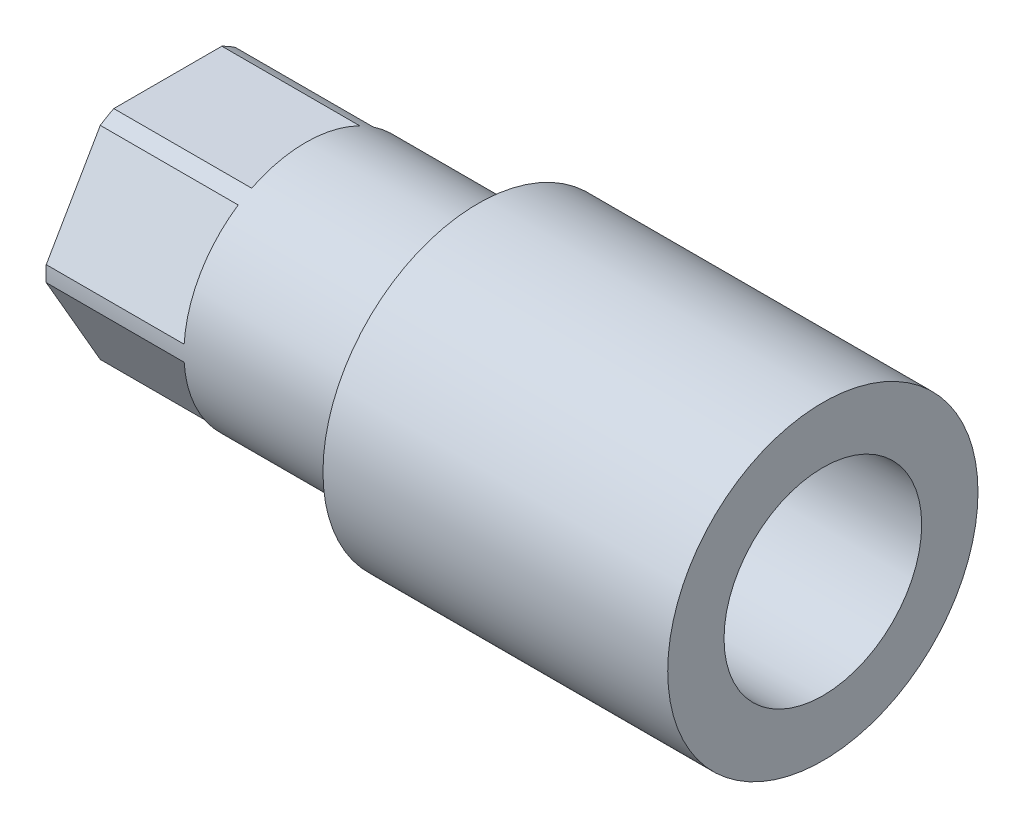
ISO-10303-21;
HEADER;
FILE_DESCRIPTION(('STEP AP214'),'2;1');
FILE_NAME('part.step','',(''),(''),'','','');
FILE_SCHEMA(('AUTOMOTIVE_DESIGN { 1 0 10303 214 1 1 1 1 }'));
ENDSEC;
DATA;
#1=APPLICATION_CONTEXT('core data for automotive mechanical design processes');
#2=APPLICATION_PROTOCOL_DEFINITION('international standard','automotive_design',2000,#1);
#3=PRODUCT_CONTEXT('',#1,'mechanical');
#4=PRODUCT('Part','Part','',(#3));
#5=PRODUCT_RELATED_PRODUCT_CATEGORY('part','',(#4));
#6=PRODUCT_DEFINITION_FORMATION('','',#4);
#7=PRODUCT_DEFINITION_CONTEXT('part definition',#1,'design');
#8=PRODUCT_DEFINITION('design','',#6,#7);
#9=PRODUCT_DEFINITION_SHAPE('','',#8);
#10=(LENGTH_UNIT() NAMED_UNIT(*) SI_UNIT(.MILLI.,.METRE.));
#11=(NAMED_UNIT(*) PLANE_ANGLE_UNIT() SI_UNIT($,.RADIAN.));
#12=(NAMED_UNIT(*) SI_UNIT($,.STERADIAN.) SOLID_ANGLE_UNIT());
#13=UNCERTAINTY_MEASURE_WITH_UNIT(LENGTH_MEASURE(1.E-05),#10,'distance_accuracy_value','');
#14=(GEOMETRIC_REPRESENTATION_CONTEXT(3) GLOBAL_UNCERTAINTY_ASSIGNED_CONTEXT((#13)) GLOBAL_UNIT_ASSIGNED_CONTEXT((#10,
#11,#12)) REPRESENTATION_CONTEXT('',''));
#15=CARTESIAN_POINT('',(0.,0.,0.));
#16=DIRECTION('',(0.,0.,1.));
#17=DIRECTION('',(1.,0.,0.));
#18=AXIS2_PLACEMENT_3D('',#15,#16,#17);
#19=CARTESIAN_POINT('',(0.,0.,0.));
#20=DIRECTION('',(-1.,0.,0.));
#21=DIRECTION('',(0.,0.,1.));
#22=AXIS2_PLACEMENT_3D('',#19,#20,#21);
#23=CYLINDRICAL_SURFACE('',#22,10.6);
#24=CARTESIAN_POINT('',(27.,0.,0.));
#25=DIRECTION('',(-1.,0.,0.));
#26=DIRECTION('',(0.,0.,1.));
#27=AXIS2_PLACEMENT_3D('',#24,#25,#26);
#28=CIRCLE('',#27,10.6);
#29=CARTESIAN_POINT('',(27.,0.,10.6));
#30=VERTEX_POINT('',#29);
#31=EDGE_CURVE('E214',#30,#30,#28,.T.);
#32=ORIENTED_EDGE('',*,*,#31,.T.);
#33=EDGE_LOOP('',(#32));
#34=FACE_BOUND('',#33,.T.);
#35=CARTESIAN_POINT('',(0.,0.,0.));
#36=DIRECTION('',(-1.,0.,0.));
#37=DIRECTION('',(0.,0.,1.));
#38=AXIS2_PLACEMENT_3D('',#35,#36,#37);
#39=CIRCLE('',#38,10.6);
#40=CARTESIAN_POINT('',(0.,9.50000000000001,-4.70212717820349));
#41=VERTEX_POINT('',#40);
#42=CARTESIAN_POINT('',(0.,8.82216158814946,-5.87617774685043));
#43=VERTEX_POINT('',#42);
#44=EDGE_CURVE('E438',#41,#43,#39,.T.);
#45=ORIENTED_EDGE('',*,*,#44,.F.);
#46=DIRECTION('',(-1.,0.,0.));
#47=VECTOR('',#46,1.);
#48=CARTESIAN_POINT('',(12.,9.50000000000001,-4.70212717820349));
#49=LINE('',#48,#47);
#50=CARTESIAN_POINT('',(12.,9.50000000000001,-4.70212717820349));
#51=VERTEX_POINT('',#50);
#52=EDGE_CURVE('E133',#51,#41,#49,.T.);
#53=ORIENTED_EDGE('',*,*,#52,.F.);
#54=CARTESIAN_POINT('',(12.,0.,0.));
#55=DIRECTION('',(-1.,0.,0.));
#56=DIRECTION('',(0.,0.,1.));
#57=AXIS2_PLACEMENT_3D('',#54,#55,#56);
#58=CIRCLE('',#57,10.6);
#59=CARTESIAN_POINT('',(12.,9.50000000000001,4.70212717820349));
#60=VERTEX_POINT('',#59);
#61=EDGE_CURVE('E134',#60,#51,#58,.T.);
#62=ORIENTED_EDGE('',*,*,#61,.F.);
#63=DIRECTION('',(-1.,0.,0.));
#64=VECTOR('',#63,1.);
#65=CARTESIAN_POINT('',(12.,9.50000000000001,4.70212717820349));
#66=LINE('',#65,#64);
#67=CARTESIAN_POINT('',(0.,9.50000000000001,4.70212717820349));
#68=VERTEX_POINT('',#67);
#69=EDGE_CURVE('E122',#60,#68,#66,.T.);
#70=ORIENTED_EDGE('',*,*,#69,.T.);
#71=CARTESIAN_POINT('',(0.,8.82216158814946,5.87617774685043));
#72=VERTEX_POINT('',#71);
#73=EDGE_CURVE('E213',#72,#68,#39,.T.);
#74=ORIENTED_EDGE('',*,*,#73,.F.);
#75=DIRECTION('',(-1.,0.,0.));
#76=VECTOR('',#75,1.);
#77=CARTESIAN_POINT('',(12.,8.82216158814946,5.87617774685043));
#78=LINE('',#77,#76);
#79=CARTESIAN_POINT('',(12.,8.82216158814946,5.87617774685043));
#80=VERTEX_POINT('',#79);
#81=EDGE_CURVE('E170',#80,#72,#78,.T.);
#82=ORIENTED_EDGE('',*,*,#81,.F.);
#83=CARTESIAN_POINT('',(12.,0.,0.));
#84=DIRECTION('',(-1.,0.,0.));
#85=DIRECTION('',(0.,0.,1.));
#86=AXIS2_PLACEMENT_3D('',#83,#84,#85);
#87=CIRCLE('',#86,10.6);
#88=CARTESIAN_POINT('',(12.,0.677838411850547,10.5783049250539));
#89=VERTEX_POINT('',#88);
#90=EDGE_CURVE('E176',#89,#80,#87,.T.);
#91=ORIENTED_EDGE('',*,*,#90,.F.);
#92=DIRECTION('',(-1.,0.,0.));
#93=VECTOR('',#92,1.);
#94=CARTESIAN_POINT('',(12.,0.677838411850547,10.5783049250539));
#95=LINE('',#94,#93);
#96=CARTESIAN_POINT('',(0.,0.677838411850547,10.5783049250539));
#97=VERTEX_POINT('',#96);
#98=EDGE_CURVE('E180',#89,#97,#95,.T.);
#99=ORIENTED_EDGE('',*,*,#98,.T.);
#100=CARTESIAN_POINT('',(0.,-0.677838411850547,10.5783049250539));
#101=VERTEX_POINT('',#100);
#102=EDGE_CURVE('E209',#101,#97,#39,.T.);
#103=ORIENTED_EDGE('',*,*,#102,.F.);
#104=DIRECTION('',(-1.,0.,0.));
#105=VECTOR('',#104,1.);
#106=CARTESIAN_POINT('',(12.,-0.677838411850547,10.5783049250539));
#107=LINE('',#106,#105);
#108=CARTESIAN_POINT('',(12.,-0.677838411850547,10.5783049250539));
#109=VERTEX_POINT('',#108);
#110=EDGE_CURVE('E49',#109,#101,#107,.T.);
#111=ORIENTED_EDGE('',*,*,#110,.F.);
#112=CARTESIAN_POINT('',(12.,0.,0.));
#113=DIRECTION('',(-1.,0.,0.));
#114=DIRECTION('',(0.,0.,1.));
#115=AXIS2_PLACEMENT_3D('',#112,#113,#114);
#116=CIRCLE('',#115,10.6);
#117=CARTESIAN_POINT('',(12.,-8.82216158814946,5.87617774685043));
#118=VERTEX_POINT('',#117);
#119=EDGE_CURVE('E188',#118,#109,#116,.T.);
#120=ORIENTED_EDGE('',*,*,#119,.F.);
#121=DIRECTION('',(-1.,0.,0.));
#122=VECTOR('',#121,1.);
#123=CARTESIAN_POINT('',(12.,-8.82216158814946,5.87617774685043));
#124=LINE('',#123,#122);
#125=CARTESIAN_POINT('',(0.,-8.82216158814946,5.87617774685043));
#126=VERTEX_POINT('',#125);
#127=EDGE_CURVE('E192',#118,#126,#124,.T.);
#128=ORIENTED_EDGE('',*,*,#127,.T.);
#129=CARTESIAN_POINT('',(0.,-9.5,4.7021271782035));
#130=VERTEX_POINT('',#129);
#131=EDGE_CURVE('E212',#130,#126,#39,.T.);
#132=ORIENTED_EDGE('',*,*,#131,.F.);
#133=DIRECTION('',(-1.,0.,0.));
#134=VECTOR('',#133,1.);
#135=CARTESIAN_POINT('',(12.,-9.5,4.7021271782035));
#136=LINE('',#135,#134);
#137=CARTESIAN_POINT('',(12.,-9.5,4.7021271782035));
#138=VERTEX_POINT('',#137);
#139=EDGE_CURVE('E57',#138,#130,#136,.T.);
#140=ORIENTED_EDGE('',*,*,#139,.F.);
#141=CARTESIAN_POINT('',(12.,0.,0.));
#142=DIRECTION('',(-1.,0.,0.));
#143=DIRECTION('',(0.,0.,1.));
#144=AXIS2_PLACEMENT_3D('',#141,#142,#143);
#145=CIRCLE('',#144,10.6);
#146=CARTESIAN_POINT('',(12.,-9.5,-4.7021271782035));
#147=VERTEX_POINT('',#146);
#148=EDGE_CURVE('E199',#147,#138,#145,.T.);
#149=ORIENTED_EDGE('',*,*,#148,.F.);
#150=DIRECTION('',(-1.,0.,0.));
#151=VECTOR('',#150,1.);
#152=CARTESIAN_POINT('',(12.,-9.5,-4.7021271782035));
#153=LINE('',#152,#151);
#154=CARTESIAN_POINT('',(0.,-9.5,-4.7021271782035));
#155=VERTEX_POINT('',#154);
#156=EDGE_CURVE('E202',#147,#155,#153,.T.);
#157=ORIENTED_EDGE('',*,*,#156,.T.);
#158=CARTESIAN_POINT('',(0.,-8.82216158814946,-5.87617774685042));
#159=VERTEX_POINT('',#158);
#160=EDGE_CURVE('E433',#159,#155,#39,.T.);
#161=ORIENTED_EDGE('',*,*,#160,.F.);
#162=DIRECTION('',(-1.,0.,0.));
#163=VECTOR('',#162,1.);
#164=CARTESIAN_POINT('',(12.,-8.82216158814946,-5.87617774685042));
#165=LINE('',#164,#163);
#166=CARTESIAN_POINT('',(12.,-8.82216158814946,-5.87617774685042));
#167=VERTEX_POINT('',#166);
#168=EDGE_CURVE('E156',#167,#159,#165,.T.);
#169=ORIENTED_EDGE('',*,*,#168,.F.);
#170=CARTESIAN_POINT('',(12.,0.,0.));
#171=DIRECTION('',(-1.,0.,0.));
#172=DIRECTION('',(0.,0.,1.));
#173=AXIS2_PLACEMENT_3D('',#170,#171,#172);
#174=CIRCLE('',#173,10.6);
#175=CARTESIAN_POINT('',(12.,-0.67783841185054,-10.5783049250539));
#176=VERTEX_POINT('',#175);
#177=EDGE_CURVE('E149',#176,#167,#174,.T.);
#178=ORIENTED_EDGE('',*,*,#177,.F.);
#179=DIRECTION('',(-1.,0.,0.));
#180=VECTOR('',#179,1.);
#181=CARTESIAN_POINT('',(12.,-0.67783841185054,-10.5783049250539));
#182=LINE('',#181,#180);
#183=CARTESIAN_POINT('',(0.,-0.67783841185054,-10.5783049250539));
#184=VERTEX_POINT('',#183);
#185=EDGE_CURVE('E153',#176,#184,#182,.T.);
#186=ORIENTED_EDGE('',*,*,#185,.T.);
#187=CARTESIAN_POINT('',(0.,0.677838411850543,-10.5783049250539));
#188=VERTEX_POINT('',#187);
#189=EDGE_CURVE('E435',#188,#184,#39,.T.);
#190=ORIENTED_EDGE('',*,*,#189,.F.);
#191=DIRECTION('',(-1.,0.,0.));
#192=VECTOR('',#191,1.);
#193=CARTESIAN_POINT('',(12.,0.677838411850543,-10.5783049250539));
#194=LINE('',#193,#192);
#195=CARTESIAN_POINT('',(12.,0.677838411850543,-10.5783049250539));
#196=VERTEX_POINT('',#195);
#197=EDGE_CURVE('E144',#196,#188,#194,.T.);
#198=ORIENTED_EDGE('',*,*,#197,.F.);
#199=CARTESIAN_POINT('',(12.,0.,0.));
#200=DIRECTION('',(-1.,0.,0.));
#201=DIRECTION('',(0.,0.,1.));
#202=AXIS2_PLACEMENT_3D('',#199,#200,#201);
#203=CIRCLE('',#202,10.6);
#204=CARTESIAN_POINT('',(12.,8.82216158814946,-5.87617774685043));
#205=VERTEX_POINT('',#204);
#206=EDGE_CURVE('E163',#205,#196,#203,.T.);
#207=ORIENTED_EDGE('',*,*,#206,.F.);
#208=DIRECTION('',(-1.,0.,0.));
#209=VECTOR('',#208,1.);
#210=CARTESIAN_POINT('',(12.,8.82216158814946,-5.87617774685043));
#211=LINE('',#210,#209);
#212=EDGE_CURVE('E167',#205,#43,#211,.T.);
#213=ORIENTED_EDGE('',*,*,#212,.T.);
#214=EDGE_LOOP('',(#45,#53,#62,#70,#74,#82,#91,#99,#103,#111,#120,#128,#132,#140,#149,#157,#161,
#169,#178,#186,#190,#198,#207,#213));
#215=FACE_BOUND('',#214,.T.);
#216=ADVANCED_FACE('F34',(#34,#215),#23,.T.);
#217=CARTESIAN_POINT('',(0.,-10.6,0.));
#218=DIRECTION('',(-1.,0.,0.));
#219=DIRECTION('',(0.,0.,1.));
#220=AXIS2_PLACEMENT_3D('',#217,#218,#219);
#221=PLANE('',#220);
#222=CARTESIAN_POINT('',(0.,0.,0.));
#223=DIRECTION('',(-1.,0.,0.));
#224=DIRECTION('',(0.,0.,1.));
#225=AXIS2_PLACEMENT_3D('',#222,#223,#224);
#226=CIRCLE('',#225,3.175);
#227=CARTESIAN_POINT('',(0.,0.,3.175));
#228=VERTEX_POINT('',#227);
#229=EDGE_CURVE('E145',#228,#228,#226,.T.);
#230=ORIENTED_EDGE('',*,*,#229,.F.);
#231=EDGE_LOOP('',(#230));
#232=FACE_BOUND('',#231,.T.);
#233=ORIENTED_EDGE('',*,*,#73,.T.);
#234=DIRECTION('',(0.,0.,-1.));
#235=VECTOR('',#234,1.);
#236=CARTESIAN_POINT('',(0.,9.50000000000001,0.));
#237=LINE('',#236,#235);
#238=EDGE_CURVE('E128',#68,#41,#237,.T.);
#239=ORIENTED_EDGE('',*,*,#238,.T.);
#240=ORIENTED_EDGE('',*,*,#44,.T.);
#241=DIRECTION('',(0.,-0.866025403784439,-0.5));
#242=VECTOR('',#241,1.);
#243=CARTESIAN_POINT('',(0.,4.75,-8.22724133595217));
#244=LINE('',#243,#242);
#245=EDGE_CURVE('E164',#43,#188,#244,.T.);
#246=ORIENTED_EDGE('',*,*,#245,.T.);
#247=ORIENTED_EDGE('',*,*,#189,.T.);
#248=DIRECTION('',(0.,-0.866025403784439,0.5));
#249=VECTOR('',#248,1.);
#250=CARTESIAN_POINT('',(0.,-4.75,-8.22724133595217));
#251=LINE('',#250,#249);
#252=EDGE_CURVE('E150',#184,#159,#251,.T.);
#253=ORIENTED_EDGE('',*,*,#252,.T.);
#254=ORIENTED_EDGE('',*,*,#160,.T.);
#255=DIRECTION('',(0.,0.,1.));
#256=VECTOR('',#255,1.);
#257=CARTESIAN_POINT('',(0.,-9.5,0.));
#258=LINE('',#257,#256);
#259=EDGE_CURVE('E158',#155,#130,#258,.T.);
#260=ORIENTED_EDGE('',*,*,#259,.T.);
#261=ORIENTED_EDGE('',*,*,#131,.T.);
#262=DIRECTION('',(0.,0.866025403784439,0.5));
#263=VECTOR('',#262,1.);
#264=CARTESIAN_POINT('',(0.,-4.75,8.22724133595217));
#265=LINE('',#264,#263);
#266=EDGE_CURVE('E189',#126,#101,#265,.T.);
#267=ORIENTED_EDGE('',*,*,#266,.T.);
#268=ORIENTED_EDGE('',*,*,#102,.T.);
#269=DIRECTION('',(0.,0.866025403784439,-0.5));
#270=VECTOR('',#269,1.);
#271=CARTESIAN_POINT('',(0.,4.75,8.22724133595217));
#272=LINE('',#271,#270);
#273=EDGE_CURVE('E177',#97,#72,#272,.T.);
#274=ORIENTED_EDGE('',*,*,#273,.T.);
#275=EDGE_LOOP('',(#233,#239,#240,#246,#247,#253,#254,#260,#261,#267,#268,#274));
#276=FACE_BOUND('',#275,.T.);
#277=ADVANCED_FACE('F240',(#232,#276),#221,.T.);
#278=CARTESIAN_POINT('',(0.,0.,0.));
#279=DIRECTION('',(-1.,0.,0.));
#280=DIRECTION('',(0.,0.,1.));
#281=AXIS2_PLACEMENT_3D('',#278,#279,#280);
#282=CYLINDRICAL_SURFACE('',#281,3.175);
#283=ORIENTED_EDGE('',*,*,#229,.T.);
#284=EDGE_LOOP('',(#283));
#285=FACE_BOUND('',#284,.T.);
#286=CARTESIAN_POINT('',(34.,0.,0.));
#287=DIRECTION('',(-1.,0.,0.));
#288=DIRECTION('',(0.,0.,1.));
#289=AXIS2_PLACEMENT_3D('',#286,#287,#288);
#290=CIRCLE('',#289,3.175);
#291=CARTESIAN_POINT('',(34.,0.,3.175));
#292=VERTEX_POINT('',#291);
#293=EDGE_CURVE('E11',#292,#292,#290,.T.);
#294=ORIENTED_EDGE('',*,*,#293,.F.);
#295=EDGE_LOOP('',(#294));
#296=FACE_BOUND('',#295,.T.);
#297=ADVANCED_FACE('F36',(#285,#296),#282,.F.);
#298=CARTESIAN_POINT('',(34.,-3.175,0.));
#299=DIRECTION('',(1.,0.,0.));
#300=DIRECTION('',(0.,0.,-1.));
#301=AXIS2_PLACEMENT_3D('',#298,#299,#300);
#302=PLANE('',#301);
#303=ORIENTED_EDGE('',*,*,#293,.T.);
#304=EDGE_LOOP('',(#303));
#305=FACE_BOUND('',#304,.T.);
#306=CARTESIAN_POINT('',(34.,0.,0.));
#307=DIRECTION('',(-1.,0.,0.));
#308=DIRECTION('',(0.,0.,1.));
#309=AXIS2_PLACEMENT_3D('',#306,#307,#308);
#310=CIRCLE('',#309,8.6);
#311=CARTESIAN_POINT('',(34.,0.,8.6));
#312=VERTEX_POINT('',#311);
#313=EDGE_CURVE('E42',#312,#312,#310,.T.);
#314=ORIENTED_EDGE('',*,*,#313,.F.);
#315=EDGE_LOOP('',(#314));
#316=FACE_BOUND('',#315,.T.);
#317=ADVANCED_FACE('F231',(#305,#316),#302,.T.);
#318=CARTESIAN_POINT('',(0.,0.,0.));
#319=DIRECTION('',(-1.,0.,0.));
#320=DIRECTION('',(0.,0.,1.));
#321=AXIS2_PLACEMENT_3D('',#318,#319,#320);
#322=CYLINDRICAL_SURFACE('',#321,8.6);
#323=ORIENTED_EDGE('',*,*,#313,.T.);
#324=EDGE_LOOP('',(#323));
#325=FACE_BOUND('',#324,.T.);
#326=CARTESIAN_POINT('',(57.,0.,0.));
#327=DIRECTION('',(-1.,0.,0.));
#328=DIRECTION('',(0.,0.,1.));
#329=AXIS2_PLACEMENT_3D('',#326,#327,#328);
#330=CIRCLE('',#329,8.6);
#331=CARTESIAN_POINT('',(57.,0.,8.6));
#332=VERTEX_POINT('',#331);
#333=EDGE_CURVE('E223',#332,#332,#330,.T.);
#334=ORIENTED_EDGE('',*,*,#333,.F.);
#335=EDGE_LOOP('',(#334));
#336=FACE_BOUND('',#335,.T.);
#337=ADVANCED_FACE('F228',(#325,#336),#322,.F.);
#338=CARTESIAN_POINT('',(57.,-13.5,0.));
#339=DIRECTION('',(1.,0.,0.));
#340=DIRECTION('',(0.,0.,-1.));
#341=AXIS2_PLACEMENT_3D('',#338,#339,#340);
#342=PLANE('',#341);
#343=ORIENTED_EDGE('',*,*,#333,.T.);
#344=EDGE_LOOP('',(#343));
#345=FACE_BOUND('',#344,.T.);
#346=CARTESIAN_POINT('',(57.,0.,0.));
#347=DIRECTION('',(-1.,0.,0.));
#348=DIRECTION('',(0.,0.,1.));
#349=AXIS2_PLACEMENT_3D('',#346,#347,#348);
#350=CIRCLE('',#349,13.5);
#351=CARTESIAN_POINT('',(57.,0.,13.5));
#352=VERTEX_POINT('',#351);
#353=EDGE_CURVE('E220',#352,#352,#350,.T.);
#354=ORIENTED_EDGE('',*,*,#353,.F.);
#355=EDGE_LOOP('',(#354));
#356=FACE_BOUND('',#355,.T.);
#357=ADVANCED_FACE('F238',(#345,#356),#342,.T.);
#358=CARTESIAN_POINT('',(0.,0.,0.));
#359=DIRECTION('',(-1.,0.,0.));
#360=DIRECTION('',(0.,0.,1.));
#361=AXIS2_PLACEMENT_3D('',#358,#359,#360);
#362=CYLINDRICAL_SURFACE('',#361,13.5);
#363=ORIENTED_EDGE('',*,*,#353,.T.);
#364=EDGE_LOOP('',(#363));
#365=FACE_BOUND('',#364,.T.);
#366=CARTESIAN_POINT('',(27.,0.,0.));
#367=DIRECTION('',(-1.,0.,0.));
#368=DIRECTION('',(0.,0.,1.));
#369=AXIS2_PLACEMENT_3D('',#366,#367,#368);
#370=CIRCLE('',#369,13.5);
#371=CARTESIAN_POINT('',(27.,0.,13.5));
#372=VERTEX_POINT('',#371);
#373=EDGE_CURVE('E217',#372,#372,#370,.T.);
#374=ORIENTED_EDGE('',*,*,#373,.F.);
#375=EDGE_LOOP('',(#374));
#376=FACE_BOUND('',#375,.T.);
#377=ADVANCED_FACE('F256',(#365,#376),#362,.T.);
#378=CARTESIAN_POINT('',(27.,-13.5,0.));
#379=DIRECTION('',(-1.,0.,0.));
#380=DIRECTION('',(0.,0.,1.));
#381=AXIS2_PLACEMENT_3D('',#378,#379,#380);
#382=PLANE('',#381);
#383=ORIENTED_EDGE('',*,*,#373,.T.);
#384=EDGE_LOOP('',(#383));
#385=FACE_BOUND('',#384,.T.);
#386=ORIENTED_EDGE('',*,*,#31,.F.);
#387=EDGE_LOOP('',(#386));
#388=FACE_BOUND('',#387,.T.);
#389=ADVANCED_FACE('F252',(#385,#388),#382,.T.);
#390=CARTESIAN_POINT('',(12.,4.75,-8.22724133595217));
#391=DIRECTION('',(0.,0.5,-0.866025403784438));
#392=DIRECTION('',(0.,0.866025403784439,0.5));
#393=AXIS2_PLACEMENT_3D('',#390,#391,#392);
#394=PLANE('',#393);
#395=ORIENTED_EDGE('',*,*,#245,.F.);
#396=ORIENTED_EDGE('',*,*,#212,.F.);
#397=DIRECTION('',(0.,-0.866025403784439,-0.5));
#398=VECTOR('',#397,1.);
#399=CARTESIAN_POINT('',(12.,4.75,-8.22724133595217));
#400=LINE('',#399,#398);
#401=EDGE_CURVE('E161',#205,#196,#400,.T.);
#402=ORIENTED_EDGE('',*,*,#401,.T.);
#403=ORIENTED_EDGE('',*,*,#197,.T.);
#404=EDGE_LOOP('',(#395,#396,#402,#403));
#405=FACE_BOUND('',#404,.T.);
#406=ADVANCED_FACE('F255',(#405),#394,.T.);
#407=CARTESIAN_POINT('',(12.,0.,0.));
#408=DIRECTION('',(-1.,0.,0.));
#409=DIRECTION('',(0.,0.,1.));
#410=AXIS2_PLACEMENT_3D('',#407,#408,#409);
#411=PLANE('',#410);
#412=ORIENTED_EDGE('',*,*,#401,.F.);
#413=ORIENTED_EDGE('',*,*,#206,.T.);
#414=EDGE_LOOP('',(#412,#413));
#415=FACE_BOUND('',#414,.T.);
#416=ADVANCED_FACE('F288',(#415),#411,.T.);
#417=CARTESIAN_POINT('',(12.,4.75,8.22724133595217));
#418=DIRECTION('',(0.,0.5,0.866025403784439));
#419=DIRECTION('',(0.,-0.866025403784439,0.5));
#420=AXIS2_PLACEMENT_3D('',#417,#418,#419);
#421=PLANE('',#420);
#422=ORIENTED_EDGE('',*,*,#273,.F.);
#423=ORIENTED_EDGE('',*,*,#98,.F.);
#424=DIRECTION('',(0.,0.866025403784439,-0.5));
#425=VECTOR('',#424,1.);
#426=CARTESIAN_POINT('',(12.,4.75,8.22724133595217));
#427=LINE('',#426,#425);
#428=EDGE_CURVE('E174',#89,#80,#427,.T.);
#429=ORIENTED_EDGE('',*,*,#428,.T.);
#430=ORIENTED_EDGE('',*,*,#81,.T.);
#431=EDGE_LOOP('',(#422,#423,#429,#430));
#432=FACE_BOUND('',#431,.T.);
#433=ADVANCED_FACE('F297',(#432),#421,.T.);
#434=CARTESIAN_POINT('',(12.,0.,0.));
#435=DIRECTION('',(-1.,0.,0.));
#436=DIRECTION('',(0.,0.,1.));
#437=AXIS2_PLACEMENT_3D('',#434,#435,#436);
#438=PLANE('',#437);
#439=ORIENTED_EDGE('',*,*,#428,.F.);
#440=ORIENTED_EDGE('',*,*,#90,.T.);
#441=EDGE_LOOP('',(#439,#440));
#442=FACE_BOUND('',#441,.T.);
#443=ADVANCED_FACE('F305',(#442),#438,.T.);
#444=CARTESIAN_POINT('',(12.,-4.75,8.22724133595217));
#445=DIRECTION('',(0.,-0.5,0.866025403784439));
#446=DIRECTION('',(0.,-0.866025403784439,-0.5));
#447=AXIS2_PLACEMENT_3D('',#444,#445,#446);
#448=PLANE('',#447);
#449=ORIENTED_EDGE('',*,*,#266,.F.);
#450=ORIENTED_EDGE('',*,*,#127,.F.);
#451=DIRECTION('',(0.,0.866025403784439,0.5));
#452=VECTOR('',#451,1.);
#453=CARTESIAN_POINT('',(12.,-4.75,8.22724133595217));
#454=LINE('',#453,#452);
#455=EDGE_CURVE('E186',#118,#109,#454,.T.);
#456=ORIENTED_EDGE('',*,*,#455,.T.);
#457=ORIENTED_EDGE('',*,*,#110,.T.);
#458=EDGE_LOOP('',(#449,#450,#456,#457));
#459=FACE_BOUND('',#458,.T.);
#460=ADVANCED_FACE('F313',(#459),#448,.T.);
#461=CARTESIAN_POINT('',(12.,0.,0.));
#462=DIRECTION('',(-1.,0.,0.));
#463=DIRECTION('',(0.,0.,1.));
#464=AXIS2_PLACEMENT_3D('',#461,#462,#463);
#465=PLANE('',#464);
#466=ORIENTED_EDGE('',*,*,#455,.F.);
#467=ORIENTED_EDGE('',*,*,#119,.T.);
#468=EDGE_LOOP('',(#466,#467));
#469=FACE_BOUND('',#468,.T.);
#470=ADVANCED_FACE('F321',(#469),#465,.T.);
#471=CARTESIAN_POINT('',(12.,-9.5,0.));
#472=DIRECTION('',(0.,-1.,0.));
#473=DIRECTION('',(0.,0.,-1.));
#474=AXIS2_PLACEMENT_3D('',#471,#472,#473);
#475=PLANE('',#474);
#476=ORIENTED_EDGE('',*,*,#259,.F.);
#477=ORIENTED_EDGE('',*,*,#156,.F.);
#478=DIRECTION('',(0.,0.,1.));
#479=VECTOR('',#478,1.);
#480=CARTESIAN_POINT('',(12.,-9.5,0.));
#481=LINE('',#480,#479);
#482=EDGE_CURVE('E197',#147,#138,#481,.T.);
#483=ORIENTED_EDGE('',*,*,#482,.T.);
#484=ORIENTED_EDGE('',*,*,#139,.T.);
#485=EDGE_LOOP('',(#476,#477,#483,#484));
#486=FACE_BOUND('',#485,.T.);
#487=ADVANCED_FACE('F328',(#486),#475,.T.);
#488=CARTESIAN_POINT('',(12.,0.,0.));
#489=DIRECTION('',(-1.,0.,0.));
#490=DIRECTION('',(0.,0.,1.));
#491=AXIS2_PLACEMENT_3D('',#488,#489,#490);
#492=PLANE('',#491);
#493=ORIENTED_EDGE('',*,*,#482,.F.);
#494=ORIENTED_EDGE('',*,*,#148,.T.);
#495=EDGE_LOOP('',(#493,#494));
#496=FACE_BOUND('',#495,.T.);
#497=ADVANCED_FACE('F336',(#496),#492,.T.);
#498=CARTESIAN_POINT('',(12.,-4.75,-8.22724133595217));
#499=DIRECTION('',(0.,-0.5,-0.866025403784438));
#500=DIRECTION('',(0.,0.866025403784439,-0.5));
#501=AXIS2_PLACEMENT_3D('',#498,#499,#500);
#502=PLANE('',#501);
#503=ORIENTED_EDGE('',*,*,#252,.F.);
#504=ORIENTED_EDGE('',*,*,#185,.F.);
#505=DIRECTION('',(0.,-0.866025403784439,0.5));
#506=VECTOR('',#505,1.);
#507=CARTESIAN_POINT('',(12.,-4.75,-8.22724133595217));
#508=LINE('',#507,#506);
#509=EDGE_CURVE('E147',#176,#167,#508,.T.);
#510=ORIENTED_EDGE('',*,*,#509,.T.);
#511=ORIENTED_EDGE('',*,*,#168,.T.);
#512=EDGE_LOOP('',(#503,#504,#510,#511));
#513=FACE_BOUND('',#512,.T.);
#514=ADVANCED_FACE('F342',(#513),#502,.T.);
#515=CARTESIAN_POINT('',(12.,0.,0.));
#516=DIRECTION('',(-1.,0.,0.));
#517=DIRECTION('',(0.,0.,1.));
#518=AXIS2_PLACEMENT_3D('',#515,#516,#517);
#519=PLANE('',#518);
#520=ORIENTED_EDGE('',*,*,#509,.F.);
#521=ORIENTED_EDGE('',*,*,#177,.T.);
#522=EDGE_LOOP('',(#520,#521));
#523=FACE_BOUND('',#522,.T.);
#524=ADVANCED_FACE('F350',(#523),#519,.T.);
#525=CARTESIAN_POINT('',(12.,9.50000000000001,0.));
#526=DIRECTION('',(0.,1.,0.));
#527=DIRECTION('',(0.,0.,1.));
#528=AXIS2_PLACEMENT_3D('',#525,#526,#527);
#529=PLANE('',#528);
#530=ORIENTED_EDGE('',*,*,#238,.F.);
#531=ORIENTED_EDGE('',*,*,#69,.F.);
#532=DIRECTION('',(0.,0.,-1.));
#533=VECTOR('',#532,1.);
#534=CARTESIAN_POINT('',(12.,9.50000000000001,0.));
#535=LINE('',#534,#533);
#536=EDGE_CURVE('E125',#60,#51,#535,.T.);
#537=ORIENTED_EDGE('',*,*,#536,.T.);
#538=ORIENTED_EDGE('',*,*,#52,.T.);
#539=EDGE_LOOP('',(#530,#531,#537,#538));
#540=FACE_BOUND('',#539,.T.);
#541=ADVANCED_FACE('F124',(#540),#529,.T.);
#542=CARTESIAN_POINT('',(12.,0.,0.));
#543=DIRECTION('',(-1.,0.,0.));
#544=DIRECTION('',(0.,0.,1.));
#545=AXIS2_PLACEMENT_3D('',#542,#543,#544);
#546=PLANE('',#545);
#547=ORIENTED_EDGE('',*,*,#536,.F.);
#548=ORIENTED_EDGE('',*,*,#61,.T.);
#549=EDGE_LOOP('',(#547,#548));
#550=FACE_BOUND('',#549,.T.);
#551=ADVANCED_FACE('F137',(#550),#546,.T.);
#552=CLOSED_SHELL('',(#216,#277,#297,#317,#337,#357,#377,#389,#406,#416,#433,#443,#460,#470,
#487,#497,#514,#524,#541,#551));
#553=MANIFOLD_SOLID_BREP('B2',#552);
#554=ADVANCED_BREP_SHAPE_REPRESENTATION('',(#18,#553),#14);
#555=SHAPE_DEFINITION_REPRESENTATION(#9,#554);
ENDSEC;
END-ISO-10303-21;
